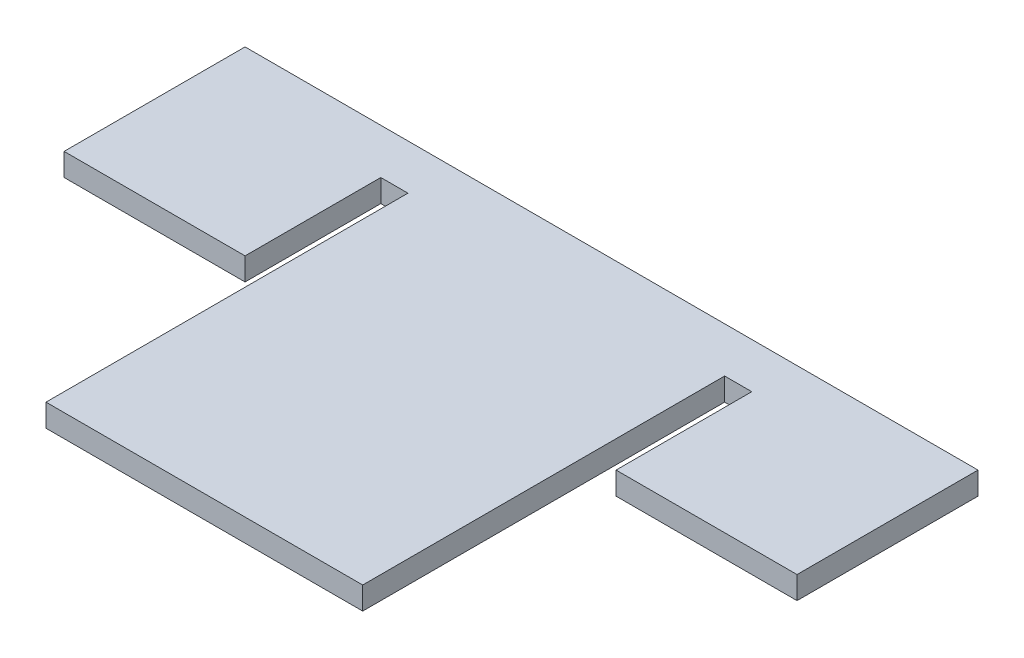
ISO-10303-21;
HEADER;
FILE_DESCRIPTION(('STEP AP214'),'2;1');
FILE_NAME('part.step','',(''),(''),'','','');
FILE_SCHEMA(('AUTOMOTIVE_DESIGN { 1 0 10303 214 1 1 1 1 }'));
ENDSEC;
DATA;
#1=APPLICATION_CONTEXT('core data for automotive mechanical design processes');
#2=APPLICATION_PROTOCOL_DEFINITION('international standard','automotive_design',2000,#1);
#3=PRODUCT_CONTEXT('',#1,'mechanical');
#4=PRODUCT('Part','Part','',(#3));
#5=PRODUCT_RELATED_PRODUCT_CATEGORY('part','',(#4));
#6=PRODUCT_DEFINITION_FORMATION('','',#4);
#7=PRODUCT_DEFINITION_CONTEXT('part definition',#1,'design');
#8=PRODUCT_DEFINITION('design','',#6,#7);
#9=PRODUCT_DEFINITION_SHAPE('','',#8);
#10=(LENGTH_UNIT() NAMED_UNIT(*) SI_UNIT(.MILLI.,.METRE.));
#11=(NAMED_UNIT(*) PLANE_ANGLE_UNIT() SI_UNIT($,.RADIAN.));
#12=(NAMED_UNIT(*) SI_UNIT($,.STERADIAN.) SOLID_ANGLE_UNIT());
#13=UNCERTAINTY_MEASURE_WITH_UNIT(LENGTH_MEASURE(1.E-05),#10,'distance_accuracy_value','');
#14=(GEOMETRIC_REPRESENTATION_CONTEXT(3) GLOBAL_UNCERTAINTY_ASSIGNED_CONTEXT((#13)) GLOBAL_UNIT_ASSIGNED_CONTEXT((#10,
#11,#12)) REPRESENTATION_CONTEXT('',''));
#15=CARTESIAN_POINT('',(0.,0.,0.));
#16=DIRECTION('',(0.,0.,1.));
#17=DIRECTION('',(1.,0.,0.));
#18=AXIS2_PLACEMENT_3D('',#15,#16,#17);
#19=CARTESIAN_POINT('',(44.45,3.175,-50.8));
#20=DIRECTION('',(-1.,0.,0.));
#21=DIRECTION('',(0.,0.,1.));
#22=AXIS2_PLACEMENT_3D('',#19,#20,#21);
#23=PLANE('',#22);
#24=DIRECTION('',(0.,0.,-1.));
#25=VECTOR('',#24,1.);
#26=CARTESIAN_POINT('',(44.45,0.,-50.8));
#27=LINE('',#26,#25);
#28=CARTESIAN_POINT('',(44.45,0.,0.));
#29=VERTEX_POINT('',#28);
#30=CARTESIAN_POINT('',(44.45,0.,-50.8));
#31=VERTEX_POINT('',#30);
#32=EDGE_CURVE('E152',#29,#31,#27,.T.);
#33=ORIENTED_EDGE('',*,*,#32,.T.);
#34=DIRECTION('',(0.,-1.,0.));
#35=VECTOR('',#34,1.);
#36=CARTESIAN_POINT('',(44.45,3.175,-50.8));
#37=LINE('',#36,#35);
#38=CARTESIAN_POINT('',(44.45,3.175,-50.8));
#39=VERTEX_POINT('',#38);
#40=EDGE_CURVE('E11',#39,#31,#37,.T.);
#41=ORIENTED_EDGE('',*,*,#40,.F.);
#42=DIRECTION('',(0.,0.,-1.));
#43=VECTOR('',#42,1.);
#44=CARTESIAN_POINT('',(44.45,3.175,-50.8));
#45=LINE('',#44,#43);
#46=CARTESIAN_POINT('',(44.45,3.175,0.));
#47=VERTEX_POINT('',#46);
#48=EDGE_CURVE('E174',#47,#39,#45,.T.);
#49=ORIENTED_EDGE('',*,*,#48,.F.);
#50=DIRECTION('',(0.,-1.,0.));
#51=VECTOR('',#50,1.);
#52=CARTESIAN_POINT('',(44.45,3.175,0.));
#53=LINE('',#52,#51);
#54=EDGE_CURVE('E148',#47,#29,#53,.T.);
#55=ORIENTED_EDGE('',*,*,#54,.T.);
#56=EDGE_LOOP('',(#33,#41,#49,#55));
#57=FACE_BOUND('',#56,.T.);
#58=ADVANCED_FACE('F32',(#57),#23,.F.);
#59=CARTESIAN_POINT('',(44.45,3.175,-50.8));
#60=DIRECTION('',(0.,0.,-1.));
#61=DIRECTION('',(-1.,0.,0.));
#62=AXIS2_PLACEMENT_3D('',#59,#60,#61);
#63=PLANE('',#62);
#64=DIRECTION('',(1.,0.,0.));
#65=VECTOR('',#64,1.);
#66=CARTESIAN_POINT('',(44.45,0.,-50.8));
#67=LINE('',#66,#65);
#68=CARTESIAN_POINT('',(48.26,0.,-50.8));
#69=VERTEX_POINT('',#68);
#70=EDGE_CURVE('E155',#31,#69,#67,.T.);
#71=ORIENTED_EDGE('',*,*,#70,.T.);
#72=DIRECTION('',(0.,-1.,0.));
#73=VECTOR('',#72,1.);
#74=CARTESIAN_POINT('',(48.26,3.175,-50.8));
#75=LINE('',#74,#73);
#76=CARTESIAN_POINT('',(48.26,3.175,-50.8));
#77=VERTEX_POINT('',#76);
#78=EDGE_CURVE('E40',#77,#69,#75,.T.);
#79=ORIENTED_EDGE('',*,*,#78,.F.);
#80=DIRECTION('',(1.,0.,0.));
#81=VECTOR('',#80,1.);
#82=CARTESIAN_POINT('',(44.45,3.175,-50.8));
#83=LINE('',#82,#81);
#84=EDGE_CURVE('E103',#39,#77,#83,.T.);
#85=ORIENTED_EDGE('',*,*,#84,.F.);
#86=ORIENTED_EDGE('',*,*,#40,.T.);
#87=EDGE_LOOP('',(#71,#79,#85,#86));
#88=FACE_BOUND('',#87,.T.);
#89=ADVANCED_FACE('F252',(#88),#63,.F.);
#90=CARTESIAN_POINT('',(48.26,3.175,-50.8));
#91=DIRECTION('',(1.,0.,0.));
#92=DIRECTION('',(0.,0.,-1.));
#93=AXIS2_PLACEMENT_3D('',#90,#91,#92);
#94=PLANE('',#93);
#95=DIRECTION('',(0.,0.,1.));
#96=VECTOR('',#95,1.);
#97=CARTESIAN_POINT('',(48.26,0.,-50.8));
#98=LINE('',#97,#96);
#99=CARTESIAN_POINT('',(48.26,0.,-31.75));
#100=VERTEX_POINT('',#99);
#101=EDGE_CURVE('E157',#69,#100,#98,.T.);
#102=ORIENTED_EDGE('',*,*,#101,.T.);
#103=DIRECTION('',(0.,-1.,0.));
#104=VECTOR('',#103,1.);
#105=CARTESIAN_POINT('',(48.26,3.175,-31.75));
#106=LINE('',#105,#104);
#107=CARTESIAN_POINT('',(48.26,3.175,-31.75));
#108=VERTEX_POINT('',#107);
#109=EDGE_CURVE('E193',#108,#100,#106,.T.);
#110=ORIENTED_EDGE('',*,*,#109,.F.);
#111=DIRECTION('',(0.,0.,1.));
#112=VECTOR('',#111,1.);
#113=CARTESIAN_POINT('',(48.26,3.175,-50.8));
#114=LINE('',#113,#112);
#115=EDGE_CURVE('E201',#77,#108,#114,.T.);
#116=ORIENTED_EDGE('',*,*,#115,.F.);
#117=ORIENTED_EDGE('',*,*,#78,.T.);
#118=EDGE_LOOP('',(#102,#110,#116,#117));
#119=FACE_BOUND('',#118,.T.);
#120=ADVANCED_FACE('F199',(#119),#94,.F.);
#121=CARTESIAN_POINT('',(73.66,3.175,-31.75));
#122=DIRECTION('',(0.,0.,-1.));
#123=DIRECTION('',(-1.,0.,0.));
#124=AXIS2_PLACEMENT_3D('',#121,#122,#123);
#125=PLANE('',#124);
#126=DIRECTION('',(1.,0.,0.));
#127=VECTOR('',#126,1.);
#128=CARTESIAN_POINT('',(73.66,0.,-31.75));
#129=LINE('',#128,#127);
#130=CARTESIAN_POINT('',(73.66,0.,-31.75));
#131=VERTEX_POINT('',#130);
#132=EDGE_CURVE('E159',#100,#131,#129,.T.);
#133=ORIENTED_EDGE('',*,*,#132,.T.);
#134=DIRECTION('',(0.,-1.,0.));
#135=VECTOR('',#134,1.);
#136=CARTESIAN_POINT('',(73.66,3.175,-31.75));
#137=LINE('',#136,#135);
#138=CARTESIAN_POINT('',(73.66,3.175,-31.75));
#139=VERTEX_POINT('',#138);
#140=EDGE_CURVE('E190',#139,#131,#137,.T.);
#141=ORIENTED_EDGE('',*,*,#140,.F.);
#142=DIRECTION('',(1.,0.,0.));
#143=VECTOR('',#142,1.);
#144=CARTESIAN_POINT('',(73.66,3.175,-31.75));
#145=LINE('',#144,#143);
#146=EDGE_CURVE('E219',#108,#139,#145,.T.);
#147=ORIENTED_EDGE('',*,*,#146,.F.);
#148=ORIENTED_EDGE('',*,*,#109,.T.);
#149=EDGE_LOOP('',(#133,#141,#147,#148));
#150=FACE_BOUND('',#149,.T.);
#151=ADVANCED_FACE('F210',(#150),#125,.F.);
#152=CARTESIAN_POINT('',(73.66,3.175,-57.15));
#153=DIRECTION('',(-1.,0.,0.));
#154=DIRECTION('',(0.,0.,1.));
#155=AXIS2_PLACEMENT_3D('',#152,#153,#154);
#156=PLANE('',#155);
#157=DIRECTION('',(0.,0.,-1.));
#158=VECTOR('',#157,1.);
#159=CARTESIAN_POINT('',(73.66,0.,-57.15));
#160=LINE('',#159,#158);
#161=CARTESIAN_POINT('',(73.66,0.,-57.15));
#162=VERTEX_POINT('',#161);
#163=EDGE_CURVE('E161',#131,#162,#160,.T.);
#164=ORIENTED_EDGE('',*,*,#163,.T.);
#165=DIRECTION('',(0.,-1.,0.));
#166=VECTOR('',#165,1.);
#167=CARTESIAN_POINT('',(73.66,3.175,-57.15));
#168=LINE('',#167,#166);
#169=CARTESIAN_POINT('',(73.66,3.175,-57.15));
#170=VERTEX_POINT('',#169);
#171=EDGE_CURVE('E187',#170,#162,#168,.T.);
#172=ORIENTED_EDGE('',*,*,#171,.F.);
#173=DIRECTION('',(0.,0.,-1.));
#174=VECTOR('',#173,1.);
#175=CARTESIAN_POINT('',(73.66,3.175,-57.15));
#176=LINE('',#175,#174);
#177=EDGE_CURVE('E216',#139,#170,#176,.T.);
#178=ORIENTED_EDGE('',*,*,#177,.F.);
#179=ORIENTED_EDGE('',*,*,#140,.T.);
#180=EDGE_LOOP('',(#164,#172,#178,#179));
#181=FACE_BOUND('',#180,.T.);
#182=ADVANCED_FACE('F214',(#181),#156,.F.);
#183=CARTESIAN_POINT('',(-29.21,3.175,-57.15));
#184=DIRECTION('',(0.,0.,1.));
#185=DIRECTION('',(1.,0.,0.));
#186=AXIS2_PLACEMENT_3D('',#183,#184,#185);
#187=PLANE('',#186);
#188=DIRECTION('',(-1.,0.,0.));
#189=VECTOR('',#188,1.);
#190=CARTESIAN_POINT('',(-29.21,0.,-57.15));
#191=LINE('',#190,#189);
#192=CARTESIAN_POINT('',(-29.21,0.,-57.15));
#193=VERTEX_POINT('',#192);
#194=EDGE_CURVE('E163',#162,#193,#191,.T.);
#195=ORIENTED_EDGE('',*,*,#194,.T.);
#196=DIRECTION('',(0.,-1.,0.));
#197=VECTOR('',#196,1.);
#198=CARTESIAN_POINT('',(-29.21,3.175,-57.15));
#199=LINE('',#198,#197);
#200=CARTESIAN_POINT('',(-29.21,3.175,-57.15));
#201=VERTEX_POINT('',#200);
#202=EDGE_CURVE('E184',#201,#193,#199,.T.);
#203=ORIENTED_EDGE('',*,*,#202,.F.);
#204=DIRECTION('',(-1.,0.,0.));
#205=VECTOR('',#204,1.);
#206=CARTESIAN_POINT('',(-29.21,3.175,-57.15));
#207=LINE('',#206,#205);
#208=EDGE_CURVE('E218',#170,#201,#207,.T.);
#209=ORIENTED_EDGE('',*,*,#208,.F.);
#210=ORIENTED_EDGE('',*,*,#171,.T.);
#211=EDGE_LOOP('',(#195,#203,#209,#210));
#212=FACE_BOUND('',#211,.T.);
#213=ADVANCED_FACE('F265',(#212),#187,.F.);
#214=CARTESIAN_POINT('',(-29.21,3.175,-57.15));
#215=DIRECTION('',(1.,0.,0.));
#216=DIRECTION('',(0.,0.,-1.));
#217=AXIS2_PLACEMENT_3D('',#214,#215,#216);
#218=PLANE('',#217);
#219=DIRECTION('',(0.,0.,1.));
#220=VECTOR('',#219,1.);
#221=CARTESIAN_POINT('',(-29.21,0.,-57.15));
#222=LINE('',#221,#220);
#223=CARTESIAN_POINT('',(-29.21,0.,-31.75));
#224=VERTEX_POINT('',#223);
#225=EDGE_CURVE('E165',#193,#224,#222,.T.);
#226=ORIENTED_EDGE('',*,*,#225,.T.);
#227=DIRECTION('',(0.,-1.,0.));
#228=VECTOR('',#227,1.);
#229=CARTESIAN_POINT('',(-29.21,3.175,-31.75));
#230=LINE('',#229,#228);
#231=CARTESIAN_POINT('',(-29.21,3.175,-31.75));
#232=VERTEX_POINT('',#231);
#233=EDGE_CURVE('E181',#232,#224,#230,.T.);
#234=ORIENTED_EDGE('',*,*,#233,.F.);
#235=DIRECTION('',(0.,0.,1.));
#236=VECTOR('',#235,1.);
#237=CARTESIAN_POINT('',(-29.21,3.175,-57.15));
#238=LINE('',#237,#236);
#239=EDGE_CURVE('E221',#201,#232,#238,.T.);
#240=ORIENTED_EDGE('',*,*,#239,.F.);
#241=ORIENTED_EDGE('',*,*,#202,.T.);
#242=EDGE_LOOP('',(#226,#234,#240,#241));
#243=FACE_BOUND('',#242,.T.);
#244=ADVANCED_FACE('F268',(#243),#218,.F.);
#245=CARTESIAN_POINT('',(-29.21,3.175,-31.75));
#246=DIRECTION('',(0.,0.,-1.));
#247=DIRECTION('',(-1.,0.,0.));
#248=AXIS2_PLACEMENT_3D('',#245,#246,#247);
#249=PLANE('',#248);
#250=DIRECTION('',(1.,0.,0.));
#251=VECTOR('',#250,1.);
#252=CARTESIAN_POINT('',(-29.21,0.,-31.75));
#253=LINE('',#252,#251);
#254=CARTESIAN_POINT('',(-3.80999999999999,0.,-31.75));
#255=VERTEX_POINT('',#254);
#256=EDGE_CURVE('E167',#224,#255,#253,.T.);
#257=ORIENTED_EDGE('',*,*,#256,.T.);
#258=DIRECTION('',(0.,-1.,0.));
#259=VECTOR('',#258,1.);
#260=CARTESIAN_POINT('',(-3.80999999999999,3.175,-31.75));
#261=LINE('',#260,#259);
#262=CARTESIAN_POINT('',(-3.80999999999999,3.175,-31.75));
#263=VERTEX_POINT('',#262);
#264=EDGE_CURVE('E178',#263,#255,#261,.T.);
#265=ORIENTED_EDGE('',*,*,#264,.F.);
#266=DIRECTION('',(1.,0.,0.));
#267=VECTOR('',#266,1.);
#268=CARTESIAN_POINT('',(-29.21,3.175,-31.75));
#269=LINE('',#268,#267);
#270=EDGE_CURVE('E227',#232,#263,#269,.T.);
#271=ORIENTED_EDGE('',*,*,#270,.F.);
#272=ORIENTED_EDGE('',*,*,#233,.T.);
#273=EDGE_LOOP('',(#257,#265,#271,#272));
#274=FACE_BOUND('',#273,.T.);
#275=ADVANCED_FACE('F233',(#274),#249,.F.);
#276=CARTESIAN_POINT('',(-3.81,3.175,-50.8));
#277=DIRECTION('',(-1.,0.,0.));
#278=DIRECTION('',(0.,0.,1.));
#279=AXIS2_PLACEMENT_3D('',#276,#277,#278);
#280=PLANE('',#279);
#281=DIRECTION('',(0.,0.,-1.));
#282=VECTOR('',#281,1.);
#283=CARTESIAN_POINT('',(-3.81,0.,-50.8));
#284=LINE('',#283,#282);
#285=CARTESIAN_POINT('',(-3.81,0.,-50.8));
#286=VERTEX_POINT('',#285);
#287=EDGE_CURVE('E169',#255,#286,#284,.T.);
#288=ORIENTED_EDGE('',*,*,#287,.T.);
#289=DIRECTION('',(0.,-1.,0.));
#290=VECTOR('',#289,1.);
#291=CARTESIAN_POINT('',(-3.81,3.175,-50.8));
#292=LINE('',#291,#290);
#293=CARTESIAN_POINT('',(-3.81,3.175,-50.8));
#294=VERTEX_POINT('',#293);
#295=EDGE_CURVE('E143',#294,#286,#292,.T.);
#296=ORIENTED_EDGE('',*,*,#295,.F.);
#297=DIRECTION('',(0.,0.,-1.));
#298=VECTOR('',#297,1.);
#299=CARTESIAN_POINT('',(-3.81,3.175,-50.8));
#300=LINE('',#299,#298);
#301=EDGE_CURVE('E134',#263,#294,#300,.T.);
#302=ORIENTED_EDGE('',*,*,#301,.F.);
#303=ORIENTED_EDGE('',*,*,#264,.T.);
#304=EDGE_LOOP('',(#288,#296,#302,#303));
#305=FACE_BOUND('',#304,.T.);
#306=ADVANCED_FACE('F237',(#305),#280,.F.);
#307=CARTESIAN_POINT('',(0.,3.175,-50.8));
#308=DIRECTION('',(0.,0.,-1.));
#309=DIRECTION('',(-1.,0.,0.));
#310=AXIS2_PLACEMENT_3D('',#307,#308,#309);
#311=PLANE('',#310);
#312=DIRECTION('',(1.,0.,0.));
#313=VECTOR('',#312,1.);
#314=CARTESIAN_POINT('',(0.,0.,-50.8));
#315=LINE('',#314,#313);
#316=CARTESIAN_POINT('',(0.,0.,-50.8));
#317=VERTEX_POINT('',#316);
#318=EDGE_CURVE('E142',#286,#317,#315,.T.);
#319=ORIENTED_EDGE('',*,*,#318,.T.);
#320=DIRECTION('',(0.,-1.,0.));
#321=VECTOR('',#320,1.);
#322=CARTESIAN_POINT('',(0.,3.175,-50.8));
#323=LINE('',#322,#321);
#324=CARTESIAN_POINT('',(0.,3.175,-50.8));
#325=VERTEX_POINT('',#324);
#326=EDGE_CURVE('E139',#325,#317,#323,.T.);
#327=ORIENTED_EDGE('',*,*,#326,.F.);
#328=DIRECTION('',(1.,0.,0.));
#329=VECTOR('',#328,1.);
#330=CARTESIAN_POINT('',(0.,3.175,-50.8));
#331=LINE('',#330,#329);
#332=EDGE_CURVE('E128',#294,#325,#331,.T.);
#333=ORIENTED_EDGE('',*,*,#332,.F.);
#334=ORIENTED_EDGE('',*,*,#295,.T.);
#335=EDGE_LOOP('',(#319,#327,#333,#334));
#336=FACE_BOUND('',#335,.T.);
#337=ADVANCED_FACE('F140',(#336),#311,.F.);
#338=CARTESIAN_POINT('',(0.,3.175,-50.8));
#339=DIRECTION('',(1.,0.,0.));
#340=DIRECTION('',(0.,0.,-1.));
#341=AXIS2_PLACEMENT_3D('',#338,#339,#340);
#342=PLANE('',#341);
#343=DIRECTION('',(0.,0.,1.));
#344=VECTOR('',#343,1.);
#345=CARTESIAN_POINT('',(0.,0.,-50.8));
#346=LINE('',#345,#344);
#347=CARTESIAN_POINT('',(0.,0.,0.));
#348=VERTEX_POINT('',#347);
#349=EDGE_CURVE('E89',#317,#348,#346,.T.);
#350=ORIENTED_EDGE('',*,*,#349,.T.);
#351=DIRECTION('',(0.,-1.,0.));
#352=VECTOR('',#351,1.);
#353=CARTESIAN_POINT('',(0.,3.175,0.));
#354=LINE('',#353,#352);
#355=CARTESIAN_POINT('',(0.,3.175,0.));
#356=VERTEX_POINT('',#355);
#357=EDGE_CURVE('E144',#356,#348,#354,.T.);
#358=ORIENTED_EDGE('',*,*,#357,.F.);
#359=DIRECTION('',(0.,0.,1.));
#360=VECTOR('',#359,1.);
#361=CARTESIAN_POINT('',(0.,3.175,-50.8));
#362=LINE('',#361,#360);
#363=EDGE_CURVE('E132',#325,#356,#362,.T.);
#364=ORIENTED_EDGE('',*,*,#363,.F.);
#365=ORIENTED_EDGE('',*,*,#326,.T.);
#366=EDGE_LOOP('',(#350,#358,#364,#365));
#367=FACE_BOUND('',#366,.T.);
#368=ADVANCED_FACE('F146',(#367),#342,.F.);
#369=CARTESIAN_POINT('',(0.,3.175,0.));
#370=DIRECTION('',(0.,0.,-1.));
#371=DIRECTION('',(-1.,0.,0.));
#372=AXIS2_PLACEMENT_3D('',#369,#370,#371);
#373=PLANE('',#372);
#374=DIRECTION('',(1.,0.,0.));
#375=VECTOR('',#374,1.);
#376=CARTESIAN_POINT('',(0.,0.,0.));
#377=LINE('',#376,#375);
#378=EDGE_CURVE('E95',#348,#29,#377,.T.);
#379=ORIENTED_EDGE('',*,*,#378,.T.);
#380=ORIENTED_EDGE('',*,*,#54,.F.);
#381=DIRECTION('',(1.,0.,0.));
#382=VECTOR('',#381,1.);
#383=CARTESIAN_POINT('',(0.,3.175,0.));
#384=LINE('',#383,#382);
#385=EDGE_CURVE('E48',#356,#47,#384,.T.);
#386=ORIENTED_EDGE('',*,*,#385,.F.);
#387=ORIENTED_EDGE('',*,*,#357,.T.);
#388=EDGE_LOOP('',(#379,#380,#386,#387));
#389=FACE_BOUND('',#388,.T.);
#390=ADVANCED_FACE('F241',(#389),#373,.F.);
#391=CARTESIAN_POINT('',(0.,3.175,0.));
#392=DIRECTION('',(0.,1.,0.));
#393=DIRECTION('',(0.,0.,1.));
#394=AXIS2_PLACEMENT_3D('',#391,#392,#393);
#395=PLANE('',#394);
#396=ORIENTED_EDGE('',*,*,#48,.T.);
#397=ORIENTED_EDGE('',*,*,#84,.T.);
#398=ORIENTED_EDGE('',*,*,#115,.T.);
#399=ORIENTED_EDGE('',*,*,#146,.T.);
#400=ORIENTED_EDGE('',*,*,#177,.T.);
#401=ORIENTED_EDGE('',*,*,#208,.T.);
#402=ORIENTED_EDGE('',*,*,#239,.T.);
#403=ORIENTED_EDGE('',*,*,#270,.T.);
#404=ORIENTED_EDGE('',*,*,#301,.T.);
#405=ORIENTED_EDGE('',*,*,#332,.T.);
#406=ORIENTED_EDGE('',*,*,#363,.T.);
#407=ORIENTED_EDGE('',*,*,#385,.T.);
#408=EDGE_LOOP('',(#396,#397,#398,#399,#400,#401,#402,#403,#404,#405,#406,#407));
#409=FACE_BOUND('',#408,.T.);
#410=ADVANCED_FACE('F130',(#409),#395,.T.);
#411=CARTESIAN_POINT('',(0.,0.,0.));
#412=DIRECTION('',(0.,1.,0.));
#413=DIRECTION('',(0.,0.,1.));
#414=AXIS2_PLACEMENT_3D('',#411,#412,#413);
#415=PLANE('',#414);
#416=ORIENTED_EDGE('',*,*,#32,.F.);
#417=ORIENTED_EDGE('',*,*,#378,.F.);
#418=ORIENTED_EDGE('',*,*,#349,.F.);
#419=ORIENTED_EDGE('',*,*,#318,.F.);
#420=ORIENTED_EDGE('',*,*,#287,.F.);
#421=ORIENTED_EDGE('',*,*,#256,.F.);
#422=ORIENTED_EDGE('',*,*,#225,.F.);
#423=ORIENTED_EDGE('',*,*,#194,.F.);
#424=ORIENTED_EDGE('',*,*,#163,.F.);
#425=ORIENTED_EDGE('',*,*,#132,.F.);
#426=ORIENTED_EDGE('',*,*,#101,.F.);
#427=ORIENTED_EDGE('',*,*,#70,.F.);
#428=EDGE_LOOP('',(#416,#417,#418,#419,#420,#421,#422,#423,#424,#425,#426,#427));
#429=FACE_BOUND('',#428,.T.);
#430=ADVANCED_FACE('F205',(#429),#415,.F.);
#431=CLOSED_SHELL('',(#58,#89,#120,#151,#182,#213,#244,#275,#306,#337,#368,#390,#410,#430));
#432=MANIFOLD_SOLID_BREP('B2',#431);
#433=ADVANCED_BREP_SHAPE_REPRESENTATION('',(#18,#432),#14);
#434=SHAPE_DEFINITION_REPRESENTATION(#9,#433);
ENDSEC;
END-ISO-10303-21;
